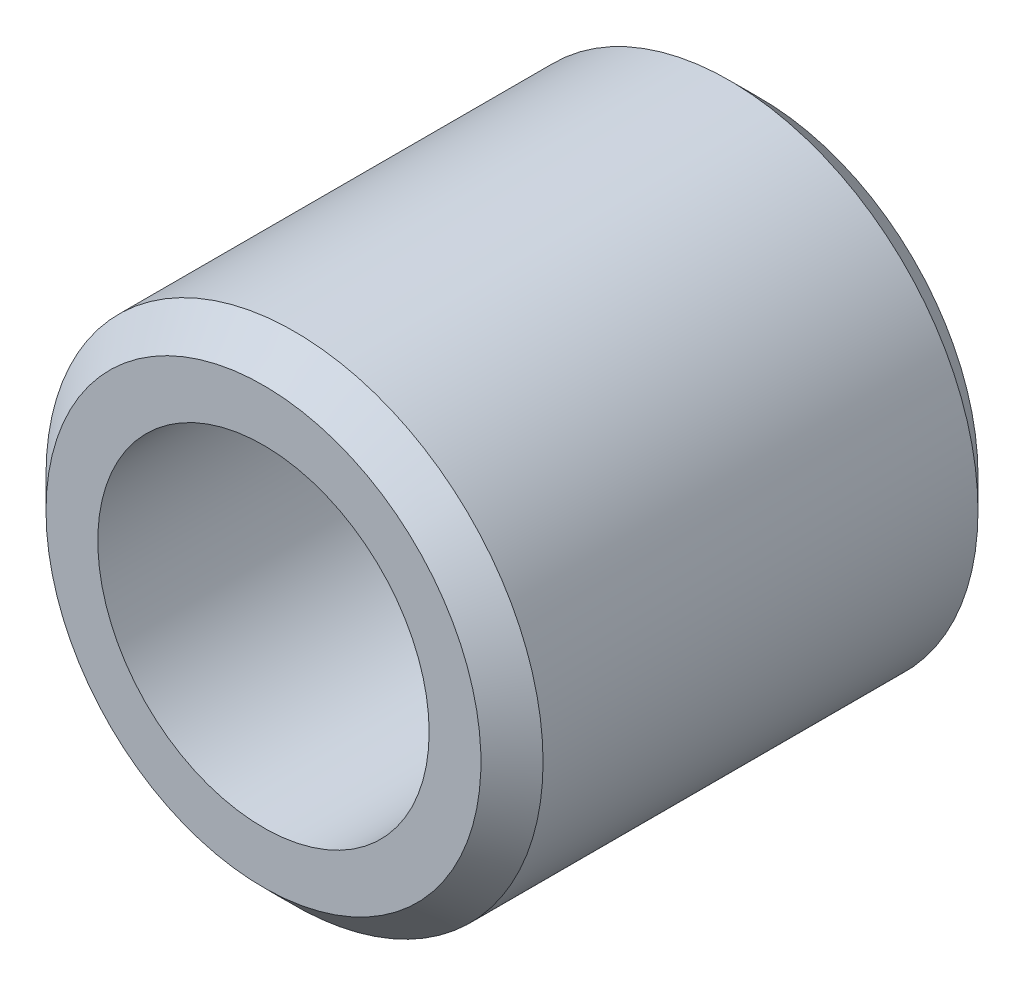
ISO-10303-21;
HEADER;
FILE_DESCRIPTION(('STEP AP214'),'2;1');
FILE_NAME('part.step','',(''),(''),'','','');
FILE_SCHEMA(('AUTOMOTIVE_DESIGN { 1 0 10303 214 1 1 1 1 }'));
ENDSEC;
DATA;
#1=APPLICATION_CONTEXT('core data for automotive mechanical design processes');
#2=APPLICATION_PROTOCOL_DEFINITION('international standard','automotive_design',2000,#1);
#3=PRODUCT_CONTEXT('',#1,'mechanical');
#4=PRODUCT('Part','Part','',(#3));
#5=PRODUCT_RELATED_PRODUCT_CATEGORY('part','',(#4));
#6=PRODUCT_DEFINITION_FORMATION('','',#4);
#7=PRODUCT_DEFINITION_CONTEXT('part definition',#1,'design');
#8=PRODUCT_DEFINITION('design','',#6,#7);
#9=PRODUCT_DEFINITION_SHAPE('','',#8);
#10=(LENGTH_UNIT() NAMED_UNIT(*) SI_UNIT(.MILLI.,.METRE.));
#11=(NAMED_UNIT(*) PLANE_ANGLE_UNIT() SI_UNIT($,.RADIAN.));
#12=(NAMED_UNIT(*) SI_UNIT($,.STERADIAN.) SOLID_ANGLE_UNIT());
#13=UNCERTAINTY_MEASURE_WITH_UNIT(LENGTH_MEASURE(1.E-05),#10,'distance_accuracy_value','');
#14=(GEOMETRIC_REPRESENTATION_CONTEXT(3) GLOBAL_UNCERTAINTY_ASSIGNED_CONTEXT((#13)) GLOBAL_UNIT_ASSIGNED_CONTEXT((#10,
#11,#12)) REPRESENTATION_CONTEXT('',''));
#15=CARTESIAN_POINT('',(0.,0.,0.));
#16=DIRECTION('',(0.,0.,1.));
#17=DIRECTION('',(1.,0.,0.));
#18=AXIS2_PLACEMENT_3D('',#15,#16,#17);
#19=CARTESIAN_POINT('',(0.,4.7625,4.7625));
#20=DIRECTION('',(0.,0.,-1.));
#21=DIRECTION('',(-1.,0.,0.));
#22=AXIS2_PLACEMENT_3D('',#19,#20,#21);
#23=PLANE('',#22);
#24=CARTESIAN_POINT('',(0.,0.,4.7625));
#25=DIRECTION('',(0.,0.,-1.));
#26=DIRECTION('',(-1.,0.,0.));
#27=AXIS2_PLACEMENT_3D('',#24,#25,#26);
#28=CIRCLE('',#27,4.1671875);
#29=CARTESIAN_POINT('',(-4.1671875,0.,4.7625));
#30=VERTEX_POINT('',#29);
#31=EDGE_CURVE('E10',#30,#30,#28,.F.);
#32=ORIENTED_EDGE('',*,*,#31,.T.);
#33=EDGE_LOOP('',(#32));
#34=FACE_BOUND('',#33,.T.);
#35=CARTESIAN_POINT('',(0.,0.,4.7625));
#36=DIRECTION('',(0.,0.,1.));
#37=DIRECTION('',(1.,0.,0.));
#38=AXIS2_PLACEMENT_3D('',#35,#36,#37);
#39=CIRCLE('',#38,3.175);
#40=CARTESIAN_POINT('',(3.175,0.,4.7625));
#41=VERTEX_POINT('',#40);
#42=EDGE_CURVE('E52',#41,#41,#39,.T.);
#43=ORIENTED_EDGE('',*,*,#42,.F.);
#44=EDGE_LOOP('',(#43));
#45=FACE_BOUND('',#44,.T.);
#46=ADVANCED_FACE('F32',(#34,#45),#23,.F.);
#47=CARTESIAN_POINT('',(0.,0.,4.7625));
#48=DIRECTION('',(0.,0.,1.));
#49=DIRECTION('',(1.,0.,0.));
#50=AXIS2_PLACEMENT_3D('',#47,#48,#49);
#51=CYLINDRICAL_SURFACE('',#50,3.175);
#52=CARTESIAN_POINT('',(0.,0.,-4.7625));
#53=DIRECTION('',(0.,0.,1.));
#54=DIRECTION('',(1.,0.,0.));
#55=AXIS2_PLACEMENT_3D('',#52,#53,#54);
#56=CIRCLE('',#55,3.175);
#57=CARTESIAN_POINT('',(3.175,0.,-4.7625));
#58=VERTEX_POINT('',#57);
#59=EDGE_CURVE('E55',#58,#58,#56,.T.);
#60=ORIENTED_EDGE('',*,*,#59,.F.);
#61=EDGE_LOOP('',(#60));
#62=FACE_BOUND('',#61,.T.);
#63=ORIENTED_EDGE('',*,*,#42,.T.);
#64=EDGE_LOOP('',(#63));
#65=FACE_BOUND('',#64,.T.);
#66=ADVANCED_FACE('F61',(#62,#65),#51,.F.);
#67=CARTESIAN_POINT('',(0.,3.175,-4.7625));
#68=DIRECTION('',(0.,0.,1.));
#69=DIRECTION('',(1.,0.,0.));
#70=AXIS2_PLACEMENT_3D('',#67,#68,#69);
#71=PLANE('',#70);
#72=CARTESIAN_POINT('',(0.,0.,-4.7625));
#73=DIRECTION('',(0.,0.,1.));
#74=DIRECTION('',(1.,0.,0.));
#75=AXIS2_PLACEMENT_3D('',#72,#73,#74);
#76=CIRCLE('',#75,4.1671875);
#77=CARTESIAN_POINT('',(4.1671875,0.,-4.7625));
#78=VERTEX_POINT('',#77);
#79=EDGE_CURVE('E39',#78,#78,#76,.F.);
#80=ORIENTED_EDGE('',*,*,#79,.T.);
#81=EDGE_LOOP('',(#80));
#82=FACE_BOUND('',#81,.T.);
#83=ORIENTED_EDGE('',*,*,#59,.T.);
#84=EDGE_LOOP('',(#83));
#85=FACE_BOUND('',#84,.T.);
#86=ADVANCED_FACE('F59',(#82,#85),#71,.F.);
#87=CARTESIAN_POINT('',(0.,0.,4.7625));
#88=DIRECTION('',(0.,0.,1.));
#89=DIRECTION('',(1.,0.,0.));
#90=AXIS2_PLACEMENT_3D('',#87,#88,#89);
#91=CYLINDRICAL_SURFACE('',#90,4.7625);
#92=CARTESIAN_POINT('',(0.,0.,-4.1671875));
#93=DIRECTION('',(0.,0.,1.));
#94=DIRECTION('',(1.,0.,0.));
#95=AXIS2_PLACEMENT_3D('',#92,#93,#94);
#96=CIRCLE('',#95,4.7625);
#97=CARTESIAN_POINT('',(4.7625,0.,-4.1671875));
#98=VERTEX_POINT('',#97);
#99=EDGE_CURVE('E43',#98,#98,#96,.T.);
#100=ORIENTED_EDGE('',*,*,#99,.T.);
#101=EDGE_LOOP('',(#100));
#102=FACE_BOUND('',#101,.T.);
#103=CARTESIAN_POINT('',(0.,0.,4.1671875));
#104=DIRECTION('',(0.,0.,-1.));
#105=DIRECTION('',(-1.,0.,0.));
#106=AXIS2_PLACEMENT_3D('',#103,#104,#105);
#107=CIRCLE('',#106,4.7625);
#108=CARTESIAN_POINT('',(-4.7625,0.,4.1671875));
#109=VERTEX_POINT('',#108);
#110=EDGE_CURVE('E47',#109,#109,#107,.T.);
#111=ORIENTED_EDGE('',*,*,#110,.T.);
#112=EDGE_LOOP('',(#111));
#113=FACE_BOUND('',#112,.T.);
#114=ADVANCED_FACE('F74',(#102,#113),#91,.T.);
#115=CARTESIAN_POINT('',(0.,0.,-4.1671875));
#116=DIRECTION('',(0.,0.,1.));
#117=DIRECTION('',(1.,0.,0.));
#118=AXIS2_PLACEMENT_3D('',#115,#116,#117);
#119=CONICAL_SURFACE('',#118,4.7625,0.785398163397449);
#120=ORIENTED_EDGE('',*,*,#79,.F.);
#121=EDGE_LOOP('',(#120));
#122=FACE_BOUND('',#121,.T.);
#123=ORIENTED_EDGE('',*,*,#99,.F.);
#124=EDGE_LOOP('',(#123));
#125=FACE_BOUND('',#124,.T.);
#126=ADVANCED_FACE('F72',(#122,#125),#119,.T.);
#127=CARTESIAN_POINT('',(0.,0.,4.7625));
#128=DIRECTION('',(0.,0.,-1.));
#129=DIRECTION('',(-1.,0.,0.));
#130=AXIS2_PLACEMENT_3D('',#127,#128,#129);
#131=CONICAL_SURFACE('',#130,4.1671875,0.785398163397448);
#132=ORIENTED_EDGE('',*,*,#110,.F.);
#133=EDGE_LOOP('',(#132));
#134=FACE_BOUND('',#133,.T.);
#135=ORIENTED_EDGE('',*,*,#31,.F.);
#136=EDGE_LOOP('',(#135));
#137=FACE_BOUND('',#136,.T.);
#138=ADVANCED_FACE('F34',(#134,#137),#131,.T.);
#139=CLOSED_SHELL('',(#46,#66,#86,#114,#126,#138));
#140=MANIFOLD_SOLID_BREP('B2',#139);
#141=ADVANCED_BREP_SHAPE_REPRESENTATION('',(#18,#140),#14);
#142=SHAPE_DEFINITION_REPRESENTATION(#9,#141);
ENDSEC;
END-ISO-10303-21;
